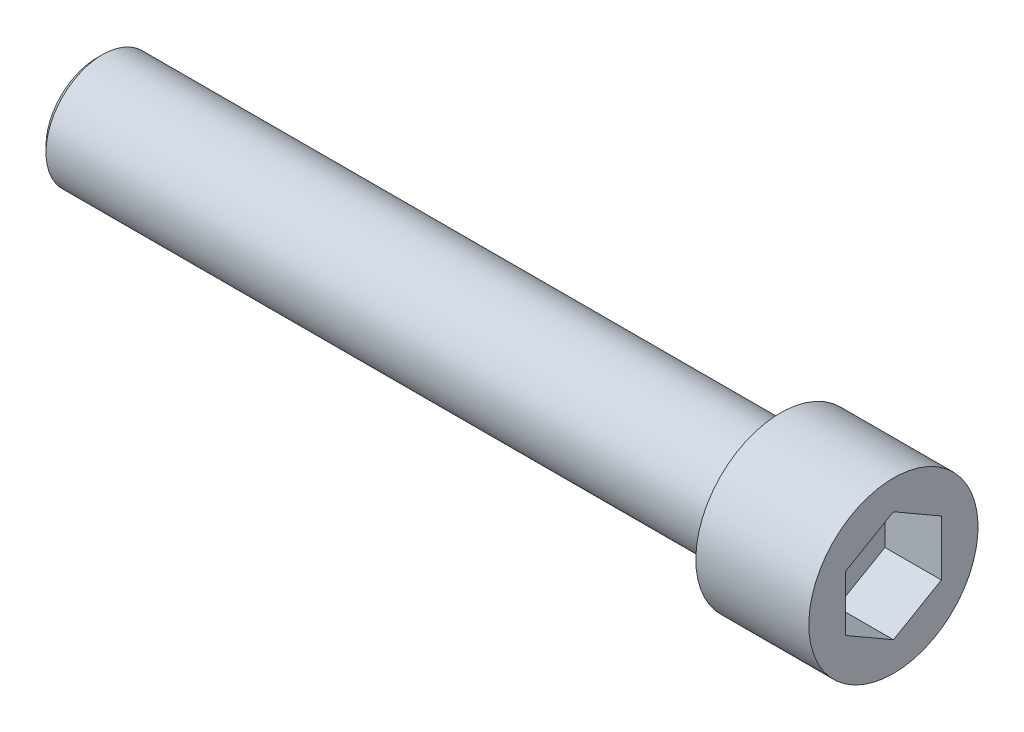
ISO-10303-21;
HEADER;
FILE_DESCRIPTION(('STEP AP214'),'2;1');
FILE_NAME('part.step','',(''),(''),'','','');
FILE_SCHEMA(('AUTOMOTIVE_DESIGN { 1 0 10303 214 1 1 1 1 }'));
ENDSEC;
DATA;
#1=APPLICATION_CONTEXT('core data for automotive mechanical design processes');
#2=APPLICATION_PROTOCOL_DEFINITION('international standard','automotive_design',2000,#1);
#3=PRODUCT_CONTEXT('',#1,'mechanical');
#4=PRODUCT('Part','Part','',(#3));
#5=PRODUCT_RELATED_PRODUCT_CATEGORY('part','',(#4));
#6=PRODUCT_DEFINITION_FORMATION('','',#4);
#7=PRODUCT_DEFINITION_CONTEXT('part definition',#1,'design');
#8=PRODUCT_DEFINITION('design','',#6,#7);
#9=PRODUCT_DEFINITION_SHAPE('','',#8);
#10=(LENGTH_UNIT() NAMED_UNIT(*) SI_UNIT(.MILLI.,.METRE.));
#11=(NAMED_UNIT(*) PLANE_ANGLE_UNIT() SI_UNIT($,.RADIAN.));
#12=(NAMED_UNIT(*) SI_UNIT($,.STERADIAN.) SOLID_ANGLE_UNIT());
#13=UNCERTAINTY_MEASURE_WITH_UNIT(LENGTH_MEASURE(1.E-05),#10,'distance_accuracy_value','');
#14=(GEOMETRIC_REPRESENTATION_CONTEXT(3) GLOBAL_UNCERTAINTY_ASSIGNED_CONTEXT((#13)) GLOBAL_UNIT_ASSIGNED_CONTEXT((#10,
#11,#12)) REPRESENTATION_CONTEXT('',''));
#15=CARTESIAN_POINT('',(0.,0.,0.));
#16=DIRECTION('',(0.,0.,1.));
#17=DIRECTION('',(1.,0.,0.));
#18=AXIS2_PLACEMENT_3D('',#15,#16,#17);
#19=CARTESIAN_POINT('',(-2985.98842375616,-2628.49768368488,-831.679744694896));
#20=DIRECTION('',(-0.999999634838613,9.93514332184842E-11,0.000854589165483596));
#21=DIRECTION('',(9.93514694978046E-11,1.,0.));
#22=AXIS2_PLACEMENT_3D('',#19,#20,#21);
#23=PLANE('',#22);
#24=CARTESIAN_POINT('',(-2985.98842379495,-2632.99768368464,-831.679789548361));
#25=DIRECTION('',(-0.999999634838613,9.93514332184879E-11,0.000854589165483596));
#26=DIRECTION('',(8.61741792570423E-09,0.999999999950325,9.96743662309618E-06));
#27=AXIS2_PLACEMENT_3D('',#24,#25,#26);
#28=CIRCLE('',#27,9.);
#29=CARTESIAN_POINT('',(-2985.98842387296,-2641.99768368464,-831.67987925529));
#30=VERTEX_POINT('',#29);
#31=EDGE_CURVE('E137',#30,#30,#28,.T.);
#32=ORIENTED_EDGE('',*,*,#31,.T.);
#33=EDGE_LOOP('',(#32));
#34=FACE_BOUND('',#33,.T.);
#35=ADVANCED_FACE('F17',(#34),#23,.T.);
#36=CARTESIAN_POINT('',(-2844.98726413329,-2642.81252862252,-831.801392196489));
#37=DIRECTION('',(-0.000427302045623108,-0.866020420021245,-0.500008449447795));
#38=DIRECTION('',(0.,0.500008495095332,-0.866020499083308));
#39=AXIS2_PLACEMENT_3D('',#36,#37,#38);
#40=PLANE('',#39);
#41=DIRECTION('',(-0.000740091618360994,0.500008632032037,-0.866020103783883));
#42=VECTOR('',#41,1.);
#43=CARTESIAN_POINT('',(-2854.98726048167,-2642.81252862153,-831.792846304844));
#44=LINE('',#43,#42);
#45=CARTESIAN_POINT('',(-2854.98726048168,-2642.81252862152,-831.792846304834));
#46=VERTEX_POINT('',#45);
#47=CARTESIAN_POINT('',(-2854.9945244473,-2637.90496661041,-840.292794285572));
#48=VERTEX_POINT('',#47);
#49=EDGE_CURVE('E48',#46,#48,#44,.T.);
#50=ORIENTED_EDGE('',*,*,#49,.F.);
#51=DIRECTION('',(-0.999999634838612,9.93514332184842E-11,0.000854589165483597));
#52=VECTOR('',#51,1.);
#53=CARTESIAN_POINT('',(-2844.98726413328,-2642.81252862253,-831.801392196499));
#54=LINE('',#53,#52);
#55=CARTESIAN_POINT('',(-2844.98726413329,-2642.81252862252,-831.801392196489));
#56=VERTEX_POINT('',#55);
#57=EDGE_CURVE('E151',#56,#46,#54,.T.);
#58=ORIENTED_EDGE('',*,*,#57,.F.);
#59=DIRECTION('',(0.000740091618360994,-0.500008632032037,0.866020103783883));
#60=VECTOR('',#59,1.);
#61=CARTESIAN_POINT('',(-2844.9945280989,-2637.90496661142,-840.301340177236));
#62=LINE('',#61,#60);
#63=CARTESIAN_POINT('',(-2844.99452809891,-2637.90496661141,-840.301340177226));
#64=VERTEX_POINT('',#63);
#65=EDGE_CURVE('E11',#64,#56,#62,.T.);
#66=ORIENTED_EDGE('',*,*,#65,.F.);
#67=DIRECTION('',(-0.999999634838612,9.93514332184842E-11,0.000854589165483597));
#68=VECTOR('',#67,1.);
#69=CARTESIAN_POINT('',(-2844.9945280989,-2637.90496661142,-840.301340177236));
#70=LINE('',#69,#68);
#71=EDGE_CURVE('E170',#64,#48,#70,.T.);
#72=ORIENTED_EDGE('',*,*,#71,.T.);
#73=EDGE_LOOP('',(#50,#58,#66,#72));
#74=FACE_BOUND('',#73,.T.);
#75=ADVANCED_FACE('F239',(#74),#40,.F.);
#76=CARTESIAN_POINT('',(-2844.99452801433,-2628.09001203567,-840.301242347289));
#77=DIRECTION('',(-0.000427287119817046,0.866030387461593,-0.499991185341142));
#78=DIRECTION('',(-0.99999963483876,0.,0.000854588993397584));
#79=AXIS2_PLACEMENT_3D('',#76,#77,#78);
#80=PLANE('',#79);
#81=DIRECTION('',(0.000740100235778919,0.499991367918934,0.866030071220506));
#82=VECTOR('',#81,1.);
#83=CARTESIAN_POINT('',(-2854.99452436271,-2628.09001203467,-840.292696455644));
#84=LINE('',#83,#82);
#85=CARTESIAN_POINT('',(-2854.99452436272,-2628.09001203468,-840.292696455634));
#86=VERTEX_POINT('',#85);
#87=CARTESIAN_POINT('',(-2854.98726031252,-2623.18261947005,-831.792650644959));
#88=VERTEX_POINT('',#87);
#89=EDGE_CURVE('E150',#86,#88,#84,.T.);
#90=ORIENTED_EDGE('',*,*,#89,.F.);
#91=DIRECTION('',(-0.999999634838612,9.93514332184842E-11,0.000854589165483597));
#92=VECTOR('',#91,1.);
#93=CARTESIAN_POINT('',(-2844.99452801432,-2628.09001203566,-840.301242347299));
#94=LINE('',#93,#92);
#95=CARTESIAN_POINT('',(-2844.99452801433,-2628.09001203567,-840.301242347289));
#96=VERTEX_POINT('',#95);
#97=EDGE_CURVE('E161',#96,#86,#94,.T.);
#98=ORIENTED_EDGE('',*,*,#97,.F.);
#99=DIRECTION('',(-0.000740100235778919,-0.499991367918934,-0.866030071220506));
#100=VECTOR('',#99,1.);
#101=CARTESIAN_POINT('',(-2844.98726396412,-2623.18261947104,-831.801196536604));
#102=LINE('',#101,#100);
#103=CARTESIAN_POINT('',(-2844.98726396413,-2623.18261947105,-831.801196536614));
#104=VERTEX_POINT('',#103);
#105=EDGE_CURVE('E28',#104,#96,#102,.T.);
#106=ORIENTED_EDGE('',*,*,#105,.F.);
#107=DIRECTION('',(-0.999999634838612,9.93514332184842E-11,0.000854589165483597));
#108=VECTOR('',#107,1.);
#109=CARTESIAN_POINT('',(-2844.98726396412,-2623.18261947104,-831.801196536604));
#110=LINE('',#109,#108);
#111=EDGE_CURVE('E193',#104,#88,#110,.T.);
#112=ORIENTED_EDGE('',*,*,#111,.T.);
#113=EDGE_LOOP('',(#90,#98,#106,#112));
#114=FACE_BOUND('',#113,.T.);
#115=ADVANCED_FACE('F229',(#114),#80,.F.);
#116=CARTESIAN_POINT('',(-2844.98726398408,-2625.49757404715,-831.801219610777));
#117=DIRECTION('',(0.999999634838613,-9.93514332184842E-11,-0.000854589165483596));
#118=DIRECTION('',(0.,-1.,1.16256368827543E-07));
#119=AXIS2_PLACEMENT_3D('',#116,#117,#118);
#120=PLANE('',#119);
#121=DIRECTION('',(-0.000740091618360994,0.500008632032037,-0.866020103783883));
#122=VECTOR('',#121,1.);
#123=CARTESIAN_POINT('',(-2844.97999999851,-2628.09018148215,-823.301248555867));
#124=LINE('',#123,#122);
#125=CARTESIAN_POINT('',(-2844.97999999852,-2628.09018148216,-823.301248555877));
#126=VERTEX_POINT('',#125);
#127=EDGE_CURVE('E189',#126,#104,#124,.T.);
#128=ORIENTED_EDGE('',*,*,#127,.T.);
#129=ORIENTED_EDGE('',*,*,#105,.T.);
#130=DIRECTION('',(-8.61741792570424E-09,-0.999999999950325,-9.96743662309618E-06));
#131=VECTOR('',#130,1.);
#132=CARTESIAN_POINT('',(-2844.99452801432,-2628.09001203566,-840.301242347299));
#133=LINE('',#132,#131);
#134=EDGE_CURVE('E165',#96,#64,#133,.T.);
#135=ORIENTED_EDGE('',*,*,#134,.T.);
#136=ORIENTED_EDGE('',*,*,#65,.T.);
#137=DIRECTION('',(0.000740100235778919,0.499991367918933,0.866030071220507));
#138=VECTOR('',#137,1.);
#139=CARTESIAN_POINT('',(-2844.98726413328,-2642.81252862253,-831.801392196499));
#140=LINE('',#139,#138);
#141=CARTESIAN_POINT('',(-2844.9800000831,-2637.90513605789,-823.301346385815));
#142=VERTEX_POINT('',#141);
#143=EDGE_CURVE('E154',#56,#142,#140,.T.);
#144=ORIENTED_EDGE('',*,*,#143,.T.);
#145=DIRECTION('',(8.61741792570424E-09,0.999999999950325,9.96743662309618E-06));
#146=VECTOR('',#145,1.);
#147=CARTESIAN_POINT('',(-2844.98000008309,-2637.9051360579,-823.301346385804));
#148=LINE('',#147,#146);
#149=EDGE_CURVE('E178',#142,#126,#148,.T.);
#150=ORIENTED_EDGE('',*,*,#149,.T.);
#151=EDGE_LOOP('',(#128,#129,#135,#136,#144,#150));
#152=FACE_BOUND('',#151,.T.);
#153=CARTESIAN_POINT('',(-2844.9872640487,-2632.99757404679,-831.801294366552));
#154=DIRECTION('',(-0.999999634838613,9.93514332184869E-11,0.000854589165483596));
#155=DIRECTION('',(8.61741792570424E-09,0.999999999950325,9.96743662309618E-06));
#156=AXIS2_PLACEMENT_3D('',#153,#154,#155);
#157=CIRCLE('',#156,15.);
#158=CARTESIAN_POINT('',(-2844.98726417796,-2647.99757404604,-831.801443878101));
#159=VERTEX_POINT('',#158);
#160=EDGE_CURVE('E204',#159,#159,#157,.T.);
#161=ORIENTED_EDGE('',*,*,#160,.F.);
#162=EDGE_LOOP('',(#161));
#163=FACE_BOUND('',#162,.T.);
#164=ADVANCED_FACE('F226',(#152,#163),#120,.T.);
#165=CARTESIAN_POINT('',(-2854.9872603971,-2632.99757404579,-831.792748474897));
#166=DIRECTION('',(-0.999999634838613,9.93514332184842E-11,0.000854589165483596));
#167=DIRECTION('',(9.93514694978046E-11,1.,0.));
#168=AXIS2_PLACEMENT_3D('',#165,#166,#167);
#169=PLANE('',#168);
#170=DIRECTION('',(0.000740091618360994,-0.500008632032037,0.866020103783883));
#171=VECTOR('',#170,1.);
#172=CARTESIAN_POINT('',(-2854.98726031251,-2623.18261947004,-831.792650644949));
#173=LINE('',#172,#171);
#174=CARTESIAN_POINT('',(-2854.9799963469,-2628.09018148116,-823.292702664222));
#175=VERTEX_POINT('',#174);
#176=EDGE_CURVE('E200',#88,#175,#173,.T.);
#177=ORIENTED_EDGE('',*,*,#176,.T.);
#178=DIRECTION('',(-8.61741792570424E-09,-0.999999999950325,-9.96743662309618E-06));
#179=VECTOR('',#178,1.);
#180=CARTESIAN_POINT('',(-2854.97999634689,-2628.09018148115,-823.292702664212));
#181=LINE('',#180,#179);
#182=CARTESIAN_POINT('',(-2854.97999643148,-2637.9051360569,-823.29280049416));
#183=VERTEX_POINT('',#182);
#184=EDGE_CURVE('E181',#175,#183,#181,.T.);
#185=ORIENTED_EDGE('',*,*,#184,.T.);
#186=DIRECTION('',(-0.000740100235778919,-0.499991367918933,-0.866030071220507));
#187=VECTOR('',#186,1.);
#188=CARTESIAN_POINT('',(-2854.97999643147,-2637.90513605691,-823.29280049415));
#189=LINE('',#188,#187);
#190=EDGE_CURVE('E157',#183,#46,#189,.T.);
#191=ORIENTED_EDGE('',*,*,#190,.T.);
#192=ORIENTED_EDGE('',*,*,#49,.T.);
#193=DIRECTION('',(8.61741792570424E-09,0.999999999950325,9.96743662309618E-06));
#194=VECTOR('',#193,1.);
#195=CARTESIAN_POINT('',(-2854.99452444728,-2637.90496661042,-840.292794285582));
#196=LINE('',#195,#194);
#197=EDGE_CURVE('E173',#48,#86,#196,.T.);
#198=ORIENTED_EDGE('',*,*,#197,.T.);
#199=ORIENTED_EDGE('',*,*,#89,.T.);
#200=EDGE_LOOP('',(#177,#185,#191,#192,#198,#199));
#201=FACE_BOUND('',#200,.T.);
#202=ADVANCED_FACE('F228',(#201),#169,.F.);
#203=CARTESIAN_POINT('',(-2844.9800000831,-2637.90513605789,-823.301346385815));
#204=DIRECTION('',(0.000427287119817046,-0.866030387461593,0.499991185341142));
#205=DIRECTION('',(-0.999999878285235,-0.000493385767977852,0.));
#206=AXIS2_PLACEMENT_3D('',#203,#204,#205);
#207=PLANE('',#206);
#208=ORIENTED_EDGE('',*,*,#190,.F.);
#209=DIRECTION('',(-0.999999634838612,9.93514332184842E-11,0.000854589165483597));
#210=VECTOR('',#209,1.);
#211=CARTESIAN_POINT('',(-2844.98000008309,-2637.9051360579,-823.301346385804));
#212=LINE('',#211,#210);
#213=EDGE_CURVE('E177',#142,#183,#212,.T.);
#214=ORIENTED_EDGE('',*,*,#213,.F.);
#215=ORIENTED_EDGE('',*,*,#143,.F.);
#216=ORIENTED_EDGE('',*,*,#57,.T.);
#217=EDGE_LOOP('',(#208,#214,#215,#216));
#218=FACE_BOUND('',#217,.T.);
#219=ADVANCED_FACE('F236',(#218),#207,.F.);
#220=CARTESIAN_POINT('',(-2844.99452809891,-2637.90496661141,-840.301340177226));
#221=DIRECTION('',(-0.000854589165440154,9.96744034772519E-06,-0.999999634788938));
#222=DIRECTION('',(-0.999999634838613,0.,0.000854589165482605));
#223=AXIS2_PLACEMENT_3D('',#220,#221,#222);
#224=PLANE('',#223);
#225=ORIENTED_EDGE('',*,*,#197,.F.);
#226=ORIENTED_EDGE('',*,*,#71,.F.);
#227=ORIENTED_EDGE('',*,*,#134,.F.);
#228=ORIENTED_EDGE('',*,*,#97,.T.);
#229=EDGE_LOOP('',(#225,#226,#227,#228));
#230=FACE_BOUND('',#229,.T.);
#231=ADVANCED_FACE('F253',(#230),#224,.F.);
#232=CARTESIAN_POINT('',(-2844.97999999852,-2628.09018148216,-823.301248555877));
#233=DIRECTION('',(0.000854589165440154,-9.96744034772519E-06,0.999999634788938));
#234=DIRECTION('',(-0.0116626361024246,-0.999931989146833,0.));
#235=AXIS2_PLACEMENT_3D('',#232,#233,#234);
#236=PLANE('',#235);
#237=ORIENTED_EDGE('',*,*,#184,.F.);
#238=DIRECTION('',(-0.999999634838612,9.93514332184842E-11,0.000854589165483597));
#239=VECTOR('',#238,1.);
#240=CARTESIAN_POINT('',(-2844.97999999851,-2628.09018148215,-823.301248555867));
#241=LINE('',#240,#239);
#242=EDGE_CURVE('E185',#126,#175,#241,.T.);
#243=ORIENTED_EDGE('',*,*,#242,.F.);
#244=ORIENTED_EDGE('',*,*,#149,.F.);
#245=ORIENTED_EDGE('',*,*,#213,.T.);
#246=EDGE_LOOP('',(#237,#243,#244,#245));
#247=FACE_BOUND('',#246,.T.);
#248=ADVANCED_FACE('F256',(#247),#236,.F.);
#249=CARTESIAN_POINT('',(-2844.98726396413,-2623.18261947105,-831.801196536614));
#250=DIRECTION('',(0.000427302045623108,0.866020420021245,0.500008449447795));
#251=DIRECTION('',(0.999999634838465,0.,-0.000854589337561687));
#252=AXIS2_PLACEMENT_3D('',#249,#250,#251);
#253=PLANE('',#252);
#254=ORIENTED_EDGE('',*,*,#176,.F.);
#255=ORIENTED_EDGE('',*,*,#111,.F.);
#256=ORIENTED_EDGE('',*,*,#127,.F.);
#257=ORIENTED_EDGE('',*,*,#242,.T.);
#258=EDGE_LOOP('',(#254,#255,#256,#257));
#259=FACE_BOUND('',#258,.T.);
#260=ADVANCED_FACE('F261',(#259),#253,.F.);
#261=CARTESIAN_POINT('',(-2854.9872603971,-2632.99757404579,-831.792748474897));
#262=DIRECTION('',(0.999999634838613,-9.93514332184869E-11,-0.000854589165483596));
#263=DIRECTION('',(8.61741792570423E-09,0.999999999950325,9.96743662309618E-06));
#264=AXIS2_PLACEMENT_3D('',#261,#262,#263);
#265=CYLINDRICAL_SURFACE('',#264,15.);
#266=ORIENTED_EDGE('',*,*,#160,.T.);
#267=DIRECTION('',(-0.999999634838612,9.93514332184842E-11,0.000854589165483596));
#268=VECTOR('',#267,1.);
#269=CARTESIAN_POINT('',(-2854.98726052636,-2647.99757404504,-831.792897986446));
#270=LINE('',#269,#268);
#271=CARTESIAN_POINT('',(-2864.98725687474,-2647.99757404405,-831.784352094791));
#272=VERTEX_POINT('',#271);
#273=EDGE_CURVE('E201',#159,#272,#270,.T.);
#274=ORIENTED_EDGE('',*,*,#273,.T.);
#275=CARTESIAN_POINT('',(-2864.98725674548,-2632.9975740448,-831.784202583242));
#276=DIRECTION('',(-0.999999634838613,9.93514332184869E-11,0.000854589165483596));
#277=DIRECTION('',(8.61741792570424E-09,0.999999999950325,9.96743662309618E-06));
#278=AXIS2_PLACEMENT_3D('',#275,#276,#277);
#279=CIRCLE('',#278,15.);
#280=EDGE_CURVE('E208',#272,#272,#279,.T.);
#281=ORIENTED_EDGE('',*,*,#280,.F.);
#282=ORIENTED_EDGE('',*,*,#273,.F.);
#283=EDGE_LOOP('',(#266,#274,#281,#282));
#284=FACE_BOUND('',#283,.T.);
#285=ADVANCED_FACE('F223',(#284),#265,.T.);
#286=CARTESIAN_POINT('',(-2864.98725663777,-2620.49757404542,-831.784077990284));
#287=DIRECTION('',(-0.999999634838613,9.93514332184842E-11,0.000854589165483596));
#288=DIRECTION('',(9.93514694978046E-11,1.,0.));
#289=AXIS2_PLACEMENT_3D('',#286,#287,#288);
#290=PLANE('',#289);
#291=CARTESIAN_POINT('',(-2864.98725673697,-2632.99758401233,-831.784192615904));
#292=DIRECTION('',(-0.999999634838613,9.9351433218487E-11,0.000854589165483596));
#293=DIRECTION('',(8.61741792570423E-09,0.999999999950325,9.96743662309618E-06));
#294=AXIS2_PLACEMENT_3D('',#291,#292,#293);
#295=CIRCLE('',#294,10.);
#296=CARTESIAN_POINT('',(-2864.98725682314,-2642.99758401184,-831.784292290271));
#297=VERTEX_POINT('',#296);
#298=EDGE_CURVE('E121',#297,#297,#295,.T.);
#299=ORIENTED_EDGE('',*,*,#298,.F.);
#300=EDGE_LOOP('',(#299));
#301=FACE_BOUND('',#300,.T.);
#302=ORIENTED_EDGE('',*,*,#280,.T.);
#303=EDGE_LOOP('',(#302));
#304=FACE_BOUND('',#303,.T.);
#305=ADVANCED_FACE('F221',(#301,#304),#290,.T.);
#306=CARTESIAN_POINT('',(-2882.98725016396,-2632.99758401055,-831.768810010926));
#307=DIRECTION('',(0.999999634838613,-9.9351433218487E-11,-0.000854589165483596));
#308=DIRECTION('',(8.61741792570423E-09,0.999999999950325,9.96743662309618E-06));
#309=AXIS2_PLACEMENT_3D('',#306,#307,#308);
#310=CYLINDRICAL_SURFACE('',#309,10.);
#311=DIRECTION('',(-0.999999634838612,9.93514332184843E-11,0.000854589165483597));
#312=VECTOR('',#311,1.);
#313=CARTESIAN_POINT('',(-2882.98725025014,-2642.99758401005,-831.768909685292));
#314=LINE('',#313,#312);
#315=CARTESIAN_POINT('',(-2984.98852434582,-2642.99758398005,-831.681242307571));
#316=VERTEX_POINT('',#315);
#317=EDGE_CURVE('E113',#297,#316,#314,.T.);
#318=ORIENTED_EDGE('',*,*,#317,.F.);
#319=ORIENTED_EDGE('',*,*,#298,.T.);
#320=ORIENTED_EDGE('',*,*,#317,.T.);
#321=CARTESIAN_POINT('',(-2984.98832444834,-2622.99758406052,-831.680544547305));
#322=CARTESIAN_POINT('',(-2984.988465315,-2622.99757999691,-831.844165682244));
#323=CARTESIAN_POINT('',(-2984.98860618142,-2623.00159848695,-832.0077865366));
#324=CARTESIAN_POINT('',(-2984.98888757753,-2623.01765565676,-832.334634229434));
#325=CARTESIAN_POINT('',(-2984.98902810723,-2623.02969433403,-832.497861068034));
#326=CARTESIAN_POINT('',(-2984.98930849371,-2623.06176695572,-832.823527326318));
#327=CARTESIAN_POINT('',(-2984.98944835048,-2623.08180089766,-832.985966746247));
#328=CARTESIAN_POINT('',(-2984.98972705676,-2623.12981468927,-833.309666915432));
#329=CARTESIAN_POINT('',(-2984.98986590627,-2623.15779453647,-833.470927665054));
#330=CARTESIAN_POINT('',(-2984.990142266,-2623.22163302516,-833.791882013339));
#331=CARTESIAN_POINT('',(-2984.99027977623,-2623.2574916642,-833.95157561249));
#332=CARTESIAN_POINT('',(-2984.99055312867,-2623.337001272,-834.269010973202));
#333=CARTESIAN_POINT('',(-2984.99068897088,-2623.38065223833,-834.42675273537));
#334=CARTESIAN_POINT('',(-2984.99095866255,-2623.47564136459,-834.739904432686));
#335=CARTESIAN_POINT('',(-2984.99109251201,-2623.52697952212,-834.895314368558));
#336=CARTESIAN_POINT('',(-2984.99135789824,-2623.63721935007,-835.203428042612));
#337=CARTESIAN_POINT('',(-2984.99148943501,-2623.69612101813,-835.356131781636));
#338=CARTESIAN_POINT('',(-2984.99174988151,-2623.82134597367,-835.658465210258));
#339=CARTESIAN_POINT('',(-2984.99187879123,-2623.88766925884,-835.808094900813));
#340=CARTESIAN_POINT('',(-2984.9921336756,-2624.0275776751,-836.103919786269));
#341=CARTESIAN_POINT('',(-2984.99225965024,-2624.10116280393,-836.250114982238));
#342=CARTESIAN_POINT('',(-2984.99250836348,-2624.25541764133,-836.538718705964));
#343=CARTESIAN_POINT('',(-2984.99263110207,-2624.33608734769,-836.6811272349));
#344=CARTESIAN_POINT('',(-2984.99287305005,-2624.50431700764,-836.961814574062));
#345=CARTESIAN_POINT('',(-2984.99299225944,-2624.5918769591,-837.100093385574));
#346=CARTESIAN_POINT('',(-2984.99322686432,-2624.77367617875,-837.372188187823));
#347=CARTESIAN_POINT('',(-2984.99334225983,-2624.86791544486,-837.50600417995));
#348=CARTESIAN_POINT('',(-2984.99356896149,-2625.06284627344,-837.768850992211));
#349=CARTESIAN_POINT('',(-2984.99368026764,-2625.16353783389,-837.897881813835));
#350=CARTESIAN_POINT('',(-2984.99389852495,-2625.37113068771,-838.150847461239));
#351=CARTESIAN_POINT('',(-2984.99400547612,-2625.47803197915,-838.274782288605));
#352=CARTESIAN_POINT('',(-2984.99421476834,-2625.69778677285,-838.517257399751));
#353=CARTESIAN_POINT('',(-2984.99431710939,-2625.81064027326,-838.63579768521));
#354=CARTESIAN_POINT('',(-2984.99451693734,-2626.04202762447,-838.867198160086));
#355=CARTESIAN_POINT('',(-2984.99461442424,-2626.16056147351,-838.980058351271));
#356=CARTESIAN_POINT('',(-2984.99480431156,-2626.40302397813,-839.199826768297));
#357=CARTESIAN_POINT('',(-2984.99489671197,-2626.52695263204,-839.30673499599));
#358=CARTESIAN_POINT('',(-2984.99507620624,-2626.77990620701,-839.514341954791));
#359=CARTESIAN_POINT('',(-2984.99516330008,-2626.90893112648,-839.615040687833));
#360=CARTESIAN_POINT('',(-2984.99533197391,-2627.1717664168,-839.809986084516));
#361=CARTESIAN_POINT('',(-2984.99541355389,-2627.30557678615,-839.904232750167));
#362=CARTESIAN_POINT('',(-2984.99557100596,-2627.57766063279,-840.086046982017));
#363=CARTESIAN_POINT('',(-2984.99564687806,-2627.71593410869,-840.173614550296));
#364=CARTESIAN_POINT('',(-2984.99579273409,-2627.99661107386,-840.341859647001));
#365=CARTESIAN_POINT('',(-2984.99586271803,-2628.13901456185,-840.422537177571));
#366=CARTESIAN_POINT('',(-2984.99599663167,-2628.42760850793,-840.576807856241));
#367=CARTESIAN_POINT('',(-2984.99606056138,-2628.57379896483,-840.650401006544));
#368=CARTESIAN_POINT('',(-2984.99618221505,-2628.86961468311,-840.790325647992));
#369=CARTESIAN_POINT('',(-2984.99623993902,-2629.01923994341,-840.856657141396));
#370=CARTESIAN_POINT('',(-2984.99634904467,-2629.32156482885,-840.981898685324));
#371=CARTESIAN_POINT('',(-2984.99640042635,-2629.47426445304,-841.040808738158));
#372=CARTESIAN_POINT('',(-2984.99649672617,-2629.78237022089,-841.151065495091));
#373=CARTESIAN_POINT('',(-2984.99654164429,-2629.93777636372,-841.202412201544));
#374=CARTESIAN_POINT('',(-2984.99662491129,-2630.25092080394,-841.297418579557));
#375=CARTESIAN_POINT('',(-2984.99666326016,-2630.40865910059,-841.34107825351));
#376=CARTESIAN_POINT('',(-2984.99673329877,-2630.72608786573,-841.420605398));
#377=CARTESIAN_POINT('',(-2984.99676498851,-2630.88577833361,-841.456472870964));
#378=CARTESIAN_POINT('',(-2984.99682163502,-2631.20672675607,-841.520329215924));
#379=CARTESIAN_POINT('',(-2984.99684659179,-2631.36798471016,-841.548318090372));
#380=CARTESIAN_POINT('',(-2984.99688971475,-2631.69167964417,-841.596349819834));
#381=CARTESIAN_POINT('',(-2984.99690788094,-2631.85411662373,-841.61639267732));
#382=CARTESIAN_POINT('',(-2984.99693738148,-2632.17977830785,-841.648484095866));
#383=CARTESIAN_POINT('',(-2984.99694871583,-2632.34300301218,-841.660532659414));
#384=CARTESIAN_POINT('',(-2984.99696452788,-2632.66984694769,-841.676606470856));
#385=CARTESIAN_POINT('',(-2984.9969690056,-2632.83346617876,-841.680631721248));
#386=CARTESIAN_POINT('',(-2984.99697109609,-2633.16070501945,-841.680649214804));
#387=CARTESIAN_POINT('',(-2984.99696870888,-2633.32432462908,-841.67664146047));
#388=CARTESIAN_POINT('',(-2984.99695707779,-2633.65117007794,-841.660602603994));
#389=CARTESIAN_POINT('',(-2984.99694783392,-2633.81439591729,-841.648571504349));
#390=CARTESIAN_POINT('',(-2984.99692251427,-2634.14006062544,-841.616514944379));
#391=CARTESIAN_POINT('',(-2984.99690643849,-2634.30249949449,-841.596489486543));
#392=CARTESIAN_POINT('',(-2984.99686749628,-2634.62619895788,-841.548492455187));
#393=CARTESIAN_POINT('',(-2984.99684462985,-2634.7874595526,-841.52052088414));
#394=CARTESIAN_POINT('',(-2984.9967921639,-2635.10841400182,-841.456699012999));
#395=CARTESIAN_POINT('',(-2984.99676256438,-2635.26810785681,-841.420848715357));
#396=CARTESIAN_POINT('',(-2984.99669670608,-2635.58554413547,-841.341355756956));
#397=CARTESIAN_POINT('',(-2984.9966604473,-2635.74328655975,-841.297713098623));
#398=CARTESIAN_POINT('',(-2984.99658136031,-2636.056439987,-841.202740556005));
#399=CARTESIAN_POINT('',(-2984.99653853211,-2636.2118509907,-841.151410674114));
#400=CARTESIAN_POINT('',(-2984.99644641195,-2636.51996720327,-841.041187339502));
#401=CARTESIAN_POINT('',(-2984.99639712,-2636.67267241299,-840.982293889135));
#402=CARTESIAN_POINT('',(-2984.9962921936,-2636.9750091824,-840.857085292757));
#403=CARTESIAN_POINT('',(-2984.99623655915,-2637.12464074305,-840.790770149057));
#404=CARTESIAN_POINT('',(-2984.99611908427,-2637.42046976357,-840.650877919486));
#405=CARTESIAN_POINT('',(-2984.99605724384,-2637.56666722451,-840.577300835876));
#406=CARTESIAN_POINT('',(-2984.99592750847,-2637.8552758676,-840.423061973398));
#407=CARTESIAN_POINT('',(-2984.99585961354,-2637.99768705094,-840.342400196736));
#408=CARTESIAN_POINT('',(-2984.99571793523,-2638.27838008193,-840.17418626152));
#409=CARTESIAN_POINT('',(-2984.99564415185,-2638.41666193087,-840.086634105112));
#410=CARTESIAN_POINT('',(-2984.99549087688,-2638.68876318371,-839.904850322124));
#411=CARTESIAN_POINT('',(-2984.9954113853,-2638.82258258899,-839.810618697624));
#412=CARTESIAN_POINT('',(-2984.99524688792,-2639.08543659505,-839.615702980444));
#413=CARTESIAN_POINT('',(-2984.99516188212,-2639.21447119733,-839.515018889773));
#414=CARTESIAN_POINT('',(-2984.9949865636,-2639.46744476443,-839.307440785673));
#415=CARTESIAN_POINT('',(-2984.99489625088,-2639.59138373085,-839.200546774176));
#416=CARTESIAN_POINT('',(-2984.99471053855,-2639.83386746851,-838.980806332988));
#417=CARTESIAN_POINT('',(-2984.99461513895,-2639.95241224144,-838.867959905149));
#418=CARTESIAN_POINT('',(-2984.99441948519,-2640.18382202888,-838.636586474662));
#419=CARTESIAN_POINT('',(-2984.99431923103,-2640.29668704515,-838.518059473782));
#420=CARTESIAN_POINT('',(-2984.99411411216,-2640.51646543835,-838.275610424558));
#421=CARTESIAN_POINT('',(-2984.99400924745,-2640.62337881713,-838.151688377894));
#422=CARTESIAN_POINT('',(-2984.9937951626,-2640.83099639169,-837.898747760585));
#423=CARTESIAN_POINT('',(-2984.99368594245,-2640.93170058941,-837.769729191526));
#424=CARTESIAN_POINT('',(-2984.99346341234,-2641.12665721587,-837.506906329912));
#425=CARTESIAN_POINT('',(-2984.99335010237,-2641.22090964663,-837.373102038847));
#426=CARTESIAN_POINT('',(-2984.99311966805,-2641.40273569522,-837.101030062005));
#427=CARTESIAN_POINT('',(-2984.99300254371,-2641.49030931514,-836.962762377618));
#428=CARTESIAN_POINT('',(-2984.9927647653,-2641.6585667871,-836.682096694739));
#429=CARTESIAN_POINT('',(-2984.99264411124,-2641.73925064129,-836.539698697533));
#430=CARTESIAN_POINT('',(-2984.99239956654,-2641.8935342239,-836.251115419069));
#431=CARTESIAN_POINT('',(-2984.9922756759,-2641.96713395453,-836.10493013899));
#432=CARTESIAN_POINT('',(-2984.992024959,-2642.10707199759,-835.809124447943));
#433=CARTESIAN_POINT('',(-2984.99189813273,-2642.17341031229,-835.659504038043));
#434=CARTESIAN_POINT('',(-2984.9916418526,-2642.29866572295,-835.357188515277));
#435=CARTESIAN_POINT('',(-2984.99151239873,-2642.35758282121,-835.204493403367));
#436=CARTESIAN_POINT('',(-2984.99125117772,-2642.46785387769,-834.896396311128));
#437=CARTESIAN_POINT('',(-2984.99111941059,-2642.51920783825,-834.740994331641));
#438=CARTESIAN_POINT('',(-2984.99085388298,-2642.61422891004,-834.427857858882));
#439=CARTESIAN_POINT('',(-2984.9907201225,-2642.65789602367,-834.270123366335));
#440=CARTESIAN_POINT('',(-2984.99045093293,-2642.73743823619,-833.952701842045));
#441=CARTESIAN_POINT('',(-2984.99031550384,-2642.77331333752,-833.793014810908));
#442=CARTESIAN_POINT('',(-2984.99004330576,-2642.83718503098,-833.472072882421));
#443=CARTESIAN_POINT('',(-2984.98990653679,-2642.86518162557,-833.310817985559));
#444=CARTESIAN_POINT('',(-2984.98963199093,-2642.91322916161,-832.987128793555));
#445=CARTESIAN_POINT('',(-2984.98949421405,-2642.93328010554,-832.82469449878));
#446=CARTESIAN_POINT('',(-2984.98921798674,-2642.96538694983,-832.499037751426));
#447=CARTESIAN_POINT('',(-2984.98907953631,-2642.97744285269,-832.335815299092));
#448=CARTESIAN_POINT('',(-2984.98880229808,-2642.99353466065,-832.008975630411));
#449=CARTESIAN_POINT('',(-2984.98866351029,-2642.99757056825,-831.845358414186));
#450=CARTESIAN_POINT('',(-2984.98852472189,-2642.99758399991,-831.681740487013));
#451=B_SPLINE_CURVE_WITH_KNOTS('',3,(#321,#322,#323,#324,#325,#326,#327,#328,#329,#330,#331,
#332,#333,#334,#335,#336,#337,#338,#339,#340,#341,#342,#343,#344,#345,#346,#347,#348,#349,#350,
#351,#352,#353,#354,#355,#356,#357,#358,#359,#360,#361,#362,#363,#364,#365,#366,#367,#368,#369,
#370,#371,#372,#373,#374,#375,#376,#377,#378,#379,#380,#381,#382,#383,#384,#385,#386,#387,#388,
#389,#390,#391,#392,#393,#394,#395,#396,#397,#398,#399,#400,#401,#402,#403,#404,#405,#406,#407,
#408,#409,#410,#411,#412,#413,#414,#415,#416,#417,#418,#419,#420,#421,#422,#423,#424,#425,#426,
#427,#428,#429,#430,#431,#432,#433,#434,#435,#436,#437,#438,#439,#440,#441,#442,#443,#444,#445,
#446,#447,#448,#449,#450),.UNSPECIFIED.,.F.,.F.,(4,2,2,2,2,2,2,2,2,2,2,2,2,2,2,2,2,2,2,2,2,2,2,
2,2,2,2,2,2,2,2,2,2,2,2,2,2,2,2,2,2,2,2,2,2,2,2,2,2,2,2,2,2,2,2,2,2,2,2,2,2,2,2,2,4),(0.,
0.490813813883259,0.981627474964289,1.47244098324309,1.96325433871969,2.45406754139419,
2.94488059126618,3.43569348833624,3.92650623260377,4.41731882406928,4.9081312627326,
5.39894354859345,5.88975568165229,6.3805676619088,6.87137948936312,7.36219116401503,
7.85300268586499,8.34381405491277,8.83462527115809,9.32543633460116,9.81624724524216,
10.3070580030809,10.7978686081171,11.2886790603514,11.7794893597838,12.2702995064133,
12.7611095002409,13.2519193412665,13.7427290294895,14.2335385649104,14.7243479475292,
15.2151571773453,15.7059662543595,16.1967751785719,16.6875839499814,17.1783925685892,
17.6692010343941,18.1600093473974,18.6508175075983,19.1416255149968,19.6324333695931,
20.1232410713872,20.6140486203791,21.104856016569,21.5956632599563,22.0864703505417,
22.5772772883247,23.0680840733054,23.5588907054841,24.0496971848603,24.5405035114344,
25.0313096852064,25.522115706176,26.0129215743436,26.5037272897087,26.9945328522717,
27.4853382620323,27.9761435189908,28.4669486231471,28.9577535745012,29.4485583730531,
29.9393630188026,30.43016751175,30.9209718518951,31.4117760392381),.UNSPECIFIED.);
#452=CARTESIAN_POINT('',(-2984.98832444834,-2622.99758406052,-831.680544547306));
#453=VERTEX_POINT('',#452);
#454=EDGE_CURVE('E117',#453,#316,#451,.T.);
#455=ORIENTED_EDGE('',*,*,#454,.F.);
#456=CARTESIAN_POINT('',(-2984.98852396942,-2642.99758396018,-831.680743725676));
#457=CARTESIAN_POINT('',(-2984.98838310055,-2642.99759010021,-831.517120609962));
#458=CARTESIAN_POINT('',(-2984.98824223188,-2642.99357350858,-831.353497724091));
#459=CARTESIAN_POINT('',(-2984.9879608311,-2642.97751977726,-831.026645794252));
#460=CARTESIAN_POINT('',(-2984.987820299,-2642.96548263506,-830.863416750407));
#461=CARTESIAN_POINT('',(-2984.9875399076,-2642.93341271287,-830.53774593854));
#462=CARTESIAN_POINT('',(-2984.9874000483,-2642.91337993038,-830.375304170763));
#463=CARTESIAN_POINT('',(-2984.98712133688,-2642.86536807747,-830.05159919422));
#464=CARTESIAN_POINT('',(-2984.98698248476,-2642.83738900457,-829.890335985821));
#465=CARTESIAN_POINT('',(-2984.98670611972,-2642.77355167674,-829.569376640365));
#466=CARTESIAN_POINT('',(-2984.9865686068,-2642.73769341937,-829.409680503797));
#467=CARTESIAN_POINT('',(-2984.98629524895,-2642.65818418192,-829.092240021105));
#468=CARTESIAN_POINT('',(-2984.98615940401,-2642.61453319941,-828.934495675588));
#469=CARTESIAN_POINT('',(-2984.98588970688,-2642.51954364486,-828.621338797195));
#470=CARTESIAN_POINT('',(-2984.98575585468,-2642.46820507041,-828.465926265045));
#471=CARTESIAN_POINT('',(-2984.98549046299,-2642.35796401192,-828.157807416967));
#472=CARTESIAN_POINT('',(-2984.9853589235,-2642.29906152553,-828.005101101881));
#473=CARTESIAN_POINT('',(-2984.98509847161,-2642.17383453819,-827.70276257258));
#474=CARTESIAN_POINT('',(-2984.98496955922,-2642.10751003493,-827.553130359324));
#475=CARTESIAN_POINT('',(-2984.98471466958,-2641.96759879117,-827.257300512687));
#476=CARTESIAN_POINT('',(-2984.98458869234,-2641.89401204841,-827.111102880377));
#477=CARTESIAN_POINT('',(-2984.984339974,-2641.73975359793,-826.822494400683));
#478=CARTESIAN_POINT('',(-2984.98421723291,-2641.659081888,-826.680083554479));
#479=CARTESIAN_POINT('',(-2984.98397528006,-2641.49084784401,-826.399391729558));
#480=CARTESIAN_POINT('',(-2984.98385606831,-2641.4032855078,-826.261110752128));
#481=CARTESIAN_POINT('',(-2984.98362145884,-2641.22148115228,-825.989011798317));
#482=CARTESIAN_POINT('',(-2984.98350606112,-2641.1272391309,-825.855193823327));
#483=CARTESIAN_POINT('',(-2984.98327935522,-2640.93230243816,-825.592343256401));
#484=CARTESIAN_POINT('',(-2984.98316804704,-2640.8316077648,-825.463310665957));
#485=CARTESIAN_POINT('',(-2984.98294978587,-2640.62400834637,-825.210341721919));
#486=CARTESIAN_POINT('',(-2984.98284283288,-2640.51710359937,-825.086405369912));
#487=CARTESIAN_POINT('',(-2984.98263353726,-2640.2973415727,-824.843927479455));
#488=CARTESIAN_POINT('',(-2984.98253119462,-2640.18448429117,-824.725385942684));
#489=CARTESIAN_POINT('',(-2984.98233136375,-2639.95308907481,-824.493983263006));
#490=CARTESIAN_POINT('',(-2984.98223387552,-2639.83455113822,-824.381122121868));
#491=CARTESIAN_POINT('',(-2984.98204398582,-2639.59208017645,-824.16135212937));
#492=CARTESIAN_POINT('',(-2984.98195158436,-2639.4681471496,-824.054443279865));
#493=CARTESIAN_POINT('',(-2984.98177208829,-2639.21518456949,-823.846835427126));
#494=CARTESIAN_POINT('',(-2984.9816849937,-2639.08615501463,-823.746136425826));
#495=CARTESIAN_POINT('',(-2984.9815163187,-2638.82331021884,-823.551190866083));
#496=CARTESIAN_POINT('',(-2984.98143473829,-2638.68949497641,-823.45694430965));
#497=CARTESIAN_POINT('',(-2984.98127728571,-2638.41740117511,-823.275130691872));
#498=CARTESIAN_POINT('',(-2984.98120141353,-2638.27912261486,-823.187563632607));
#499=CARTESIAN_POINT('',(-2984.98105555769,-2637.99843530031,-823.019319970044));
#500=CARTESIAN_POINT('',(-2984.98098557403,-2637.85602654472,-822.938643368892));
#501=CARTESIAN_POINT('',(-2984.98085166131,-2637.56742191209,-822.784374983849));
#502=CARTESIAN_POINT('',(-2984.98078773226,-2637.42122603386,-822.710783202165));
#503=CARTESIAN_POINT('',(-2984.98066608028,-2637.12539935228,-822.570861749519));
#504=CARTESIAN_POINT('',(-2984.98060835735,-2636.97576854785,-822.50453208082));
#505=CARTESIAN_POINT('',(-2984.98049925418,-2636.67343248542,-822.379294652655));
#506=CARTESIAN_POINT('',(-2984.98044787394,-2636.52072722647,-822.320386895499));
#507=CARTESIAN_POINT('',(-2984.98035157743,-2636.21261013342,-822.210135208993));
#508=CARTESIAN_POINT('',(-2984.98030666116,-2636.05719829849,-822.158791281999));
#509=CARTESIAN_POINT('',(-2984.98022339829,-2635.74404245252,-822.063790952545));
#510=CARTESIAN_POINT('',(-2984.9801850517,-2635.58629844077,-822.02013455248));
#511=CARTESIAN_POINT('',(-2984.98011501808,-2635.26885825884,-821.94061445377));
#512=CARTESIAN_POINT('',(-2984.98008333105,-2635.10916208806,-821.904750757551));
#513=CARTESIAN_POINT('',(-2984.98002669039,-2634.78820230895,-821.840902470174));
#514=CARTESIAN_POINT('',(-2984.98000173677,-2634.62693870012,-821.812917881471));
#515=CARTESIAN_POINT('',(-2984.97995862053,-2634.30323254208,-821.76489523136));
#516=CARTESIAN_POINT('',(-2984.97994045793,-2634.14078999251,-821.744857172429));
#517=CARTESIAN_POINT('',(-2984.97991096499,-2633.81511729057,-821.712775860254));
#518=CARTESIAN_POINT('',(-2984.97989963467,-2633.65188713796,-821.700732609501));
#519=CARTESIAN_POINT('',(-2984.97988383109,-2633.3250324652,-821.684669931911));
#520=CARTESIAN_POINT('',(-2984.97987935784,-2633.16140794493,-821.680650507575));
#521=CARTESIAN_POINT('',(-2984.97987727669,-2632.83415872241,-821.680645170964));
#522=CARTESIAN_POINT('',(-2984.9798796688,-2632.67053402015,-821.684659261192));
#523=CARTESIAN_POINT('',(-2984.97989131011,-2632.34367861989,-821.700711288424));
#524=CARTESIAN_POINT('',(-2984.97990055932,-2632.18044792201,-821.712749227926));
#525=CARTESIAN_POINT('',(-2984.97992589004,-2631.8547737678,-821.744819958256));
#526=CARTESIAN_POINT('',(-2984.97994197157,-2631.69233031171,-821.764852751573));
#527=CARTESIAN_POINT('',(-2984.97998092569,-2631.36862198209,-821.812864933762));
#528=CARTESIAN_POINT('',(-2984.98000379829,-2631.20735710892,-821.840844325108));
#529=CARTESIAN_POINT('',(-2984.98005627697,-2630.88639444708,-821.904682303502));
#530=CARTESIAN_POINT('',(-2984.98008588305,-2630.72669665889,-821.940540893005));
#531=CARTESIAN_POINT('',(-2984.98015175487,-2630.40925289395,-822.020050886139));
#532=CARTESIAN_POINT('',(-2984.98018802062,-2630.2515069178,-822.063702292198));
#533=CARTESIAN_POINT('',(-2984.98026712189,-2629.93834680201,-822.158692763241));
#534=CARTESIAN_POINT('',(-2984.98030995743,-2629.7829326631,-822.21003183062));
#535=CARTESIAN_POINT('',(-2984.9804020926,-2629.47481062953,-822.320273948785));
#536=CARTESIAN_POINT('',(-2984.98045139224,-2629.3221027357,-822.379177001927));
#537=CARTESIAN_POINT('',(-2984.98055633435,-2629.01976108068,-822.504405193717));
#538=CARTESIAN_POINT('',(-2984.98061197683,-2628.87012732043,-822.570730334678));
#539=CARTESIAN_POINT('',(-2984.98072946808,-2628.57429441531,-822.710642923656));
#540=CARTESIAN_POINT('',(-2984.98079131685,-2628.42809527151,-822.784230373937));
#541=CARTESIAN_POINT('',(-2984.98092106918,-2628.13948380795,-822.93849030747));
#542=CARTESIAN_POINT('',(-2984.98098897275,-2627.99707148938,-823.019162792929));
#543=CARTESIAN_POINT('',(-2984.9811306686,-2627.7163767624,-823.187398454151));
#544=CARTESIAN_POINT('',(-2984.98120446088,-2627.57809435528,-823.274961632061));
#545=CARTESIAN_POINT('',(-2984.98135775389,-2627.3059925882,-823.456767735112));
#546=CARTESIAN_POINT('',(-2984.98143725461,-2627.17217322963,-823.551010662335));
#547=CARTESIAN_POINT('',(-2984.98160177048,-2626.90931994499,-823.745949228711));
#548=CARTESIAN_POINT('',(-2984.98168678563,-2626.78028602042,-823.846644869875));
#549=CARTESIAN_POINT('',(-2984.98186212304,-2626.52731446078,-824.054246283534));
#550=CARTESIAN_POINT('',(-2984.9819524453,-2626.4033768273,-824.161152057964));
#551=CARTESIAN_POINT('',(-2984.98213817684,-2626.16089642964,-824.380916196653));
#552=CARTESIAN_POINT('',(-2984.98223358613,-2626.04235366714,-824.493774562766));
#553=CARTESIAN_POINT('',(-2984.98242925937,-2625.8109485947,-824.725172002843));
#554=CARTESIAN_POINT('',(-2984.98252952333,-2625.69808628652,-824.843711078576));
#555=CARTESIAN_POINT('',(-2984.98273466188,-2625.47831402146,-825.086184370417));
#556=CARTESIAN_POINT('',(-2984.98283953648,-2625.37140406642,-825.210118588205));
#557=CARTESIAN_POINT('',(-2984.98305364114,-2625.16379406679,-825.463083599133));
#558=CARTESIAN_POINT('',(-2984.98316287122,-2625.06309402412,-825.592114393861));
#559=CARTESIAN_POINT('',(-2984.9833854212,-2624.86814644832,-825.854961715359));
#560=CARTESIAN_POINT('',(-2984.98349874111,-2624.77389891719,-825.988778243619));
#561=CARTESIAN_POINT('',(-2984.98372919528,-2624.59208341904,-826.26087465943));
#562=CARTESIAN_POINT('',(-2984.98384632953,-2624.5045154541,-826.39915454837));
#563=CARTESIAN_POINT('',(-2984.98408412769,-2624.33627005137,-826.679844559956));
#564=CARTESIAN_POINT('',(-2984.9842047916,-2624.25559261573,-826.822254683889));
#565=CARTESIAN_POINT('',(-2984.98444935589,-2624.10132263495,-827.110862089576));
#566=CARTESIAN_POINT('',(-2984.98457325627,-2624.02773009201,-827.257059372509));
#567=CARTESIAN_POINT('',(-2984.9848239925,-2623.8878071918,-827.552888896492));
#568=CARTESIAN_POINT('',(-2984.98495082836,-2623.8214768368,-827.702521138612));
#569=CARTESIAN_POINT('',(-2984.98520712749,-2623.69623811303,-828.004860105954));
#570=CARTESIAN_POINT('',(-2984.98533659078,-2623.63732974657,-828.157566832133));
#571=CARTESIAN_POINT('',(-2984.98559783037,-2623.52707691843,-828.465686885556));
#572=CARTESIAN_POINT('',(-2984.98572960668,-2623.4757324591,-828.621100213643));
#573=CARTESIAN_POINT('',(-2984.98599515239,-2623.38073114886,-828.934259068528));
#574=CARTESIAN_POINT('',(-2984.98612892177,-2623.33707430034,-829.092004596053));
#575=CARTESIAN_POINT('',(-2984.98639812886,-2623.25755336864,-829.409447827441));
#576=CARTESIAN_POINT('',(-2984.98653356656,-2623.22168928788,-829.569145531912));
#577=CARTESIAN_POINT('',(-2984.98680578149,-2623.15784037481,-829.890108396513));
#578=CARTESIAN_POINT('',(-2984.98694255872,-2623.12985554496,-830.051373557131));
#579=CARTESIAN_POINT('',(-2984.98721712069,-2623.08183226335,-830.375082818704));
#580=CARTESIAN_POINT('',(-2984.98735490544,-2623.06179381407,-830.537526920027));
#581=CARTESIAN_POINT('',(-2984.98763114804,-2623.02971266706,-830.863202775427));
#582=CARTESIAN_POINT('',(-2984.9877696059,-2623.01766997182,-831.026434529749));
#583=CARTESIAN_POINT('',(-2984.98804685852,-2623.00160526644,-831.353292251456));
#584=CARTESIAN_POINT('',(-2984.98818565327,-2622.99758325881,-831.516918218963));
#585=CARTESIAN_POINT('',(-2984.98832444834,-2622.99758406052,-831.680544547306));
#586=B_SPLINE_CURVE_WITH_KNOTS('',3,(#456,#457,#458,#459,#460,#461,#462,#463,#464,#465,#466,
#467,#468,#469,#470,#471,#472,#473,#474,#475,#476,#477,#478,#479,#480,#481,#482,#483,#484,#485,
#486,#487,#488,#489,#490,#491,#492,#493,#494,#495,#496,#497,#498,#499,#500,#501,#502,#503,#504,
#505,#506,#507,#508,#509,#510,#511,#512,#513,#514,#515,#516,#517,#518,#519,#520,#521,#522,#523,
#524,#525,#526,#527,#528,#529,#530,#531,#532,#533,#534,#535,#536,#537,#538,#539,#540,#541,#542,
#543,#544,#545,#546,#547,#548,#549,#550,#551,#552,#553,#554,#555,#556,#557,#558,#559,#560,#561,
#562,#563,#564,#565,#566,#567,#568,#569,#570,#571,#572,#573,#574,#575,#576,#577,#578,#579,#580,
#581,#582,#583,#584,#585),.UNSPECIFIED.,.F.,.F.,(4,2,2,2,2,2,2,2,2,2,2,2,2,2,2,2,2,2,2,2,2,2,2,
2,2,2,2,2,2,2,2,2,2,2,2,2,2,2,2,2,2,2,2,2,2,2,2,2,2,2,2,2,2,2,2,2,2,2,2,2,2,2,2,2,4),(0.,
0.490819752216981,0.981639657317202,1.47245971530072,1.96327992616752,2.4541002899174,
2.94492080655081,3.43574147606733,3.92656229846713,4.41738327375028,4.90820440191664,
5.39902568296626,5.88984711689904,6.38066870371516,6.87149044341478,7.36231233599747,
7.85313438146316,8.34395657981253,8.83477893104495,9.32560143516076,9.81642409215982,
10.307246902042,10.7980698648078,11.2888929804566,11.7797162489887,12.270539670404,
12.7613632447027,13.2521869718845,13.7430108519497,14.233834884898,14.7246590707298,
15.2154834094444,15.7063079010429,16.1971325455244,16.6879573428888,17.1787822931368,
17.6696073962682,18.1604326522828,18.6512580611808,19.1420836229617,19.6329093376258,
20.1237352051734,20.6145612256044,21.1053873989184,21.5962137251159,22.0870402041967,
22.5778668361604,23.0686936210078,23.5595205587381,24.0503476493518,24.5411748928489,
25.032002289229,25.5228298384927,26.0136575406394,26.5044853956694,26.9953134035828,
27.4861415643793,27.9769698780591,28.4677983446223,28.9586269640687,29.4494557363983,
29.9402846616112,30.4311137397075,30.9219429706868,31.4127723545496),.UNSPECIFIED.);
#587=EDGE_CURVE('E131',#316,#453,#586,.T.);
#588=ORIENTED_EDGE('',*,*,#587,.F.);
#589=EDGE_LOOP('',(#318,#319,#320,#455,#588));
#590=FACE_BOUND('',#589,.T.);
#591=ADVANCED_FACE('F115',(#590),#310,.T.);
#592=CARTESIAN_POINT('',(-2985.48842397752,-2632.9976836847,-831.680216842943));
#593=DIRECTION('',(0.999999634838613,-9.93514332184881E-11,-0.000854589165483596));
#594=DIRECTION('',(8.61741792570423E-09,0.999999999950325,9.96743662309618E-06));
#595=AXIS2_PLACEMENT_3D('',#592,#593,#594);
#596=CONICAL_SURFACE('',#595,9.5,0.7853981625);
#597=DIRECTION('',(-0.707106517519611,0.707106780587082,0.000611333836605319));
#598=VECTOR('',#597,1.);
#599=CARTESIAN_POINT('',(-2985.48842405939,-2642.49768368423,-831.680311533591));
#600=LINE('',#599,#598);
#601=EDGE_CURVE('E130',#316,#30,#600,.T.);
#602=ORIENTED_EDGE('',*,*,#601,.T.);
#603=ORIENTED_EDGE('',*,*,#31,.F.);
#604=ORIENTED_EDGE('',*,*,#601,.F.);
#605=ORIENTED_EDGE('',*,*,#587,.T.);
#606=ORIENTED_EDGE('',*,*,#454,.T.);
#607=EDGE_LOOP('',(#602,#603,#604,#605,#606));
#608=FACE_BOUND('',#607,.T.);
#609=ADVANCED_FACE('F127',(#608),#596,.T.);
#610=CLOSED_SHELL('',(#35,#75,#115,#164,#202,#219,#231,#248,#260,#285,#305,#591,#609));
#611=MANIFOLD_SOLID_BREP('B1',#610);
#612=ADVANCED_BREP_SHAPE_REPRESENTATION('',(#18,#611),#14);
#613=SHAPE_DEFINITION_REPRESENTATION(#9,#612);
ENDSEC;
END-ISO-10303-21;
